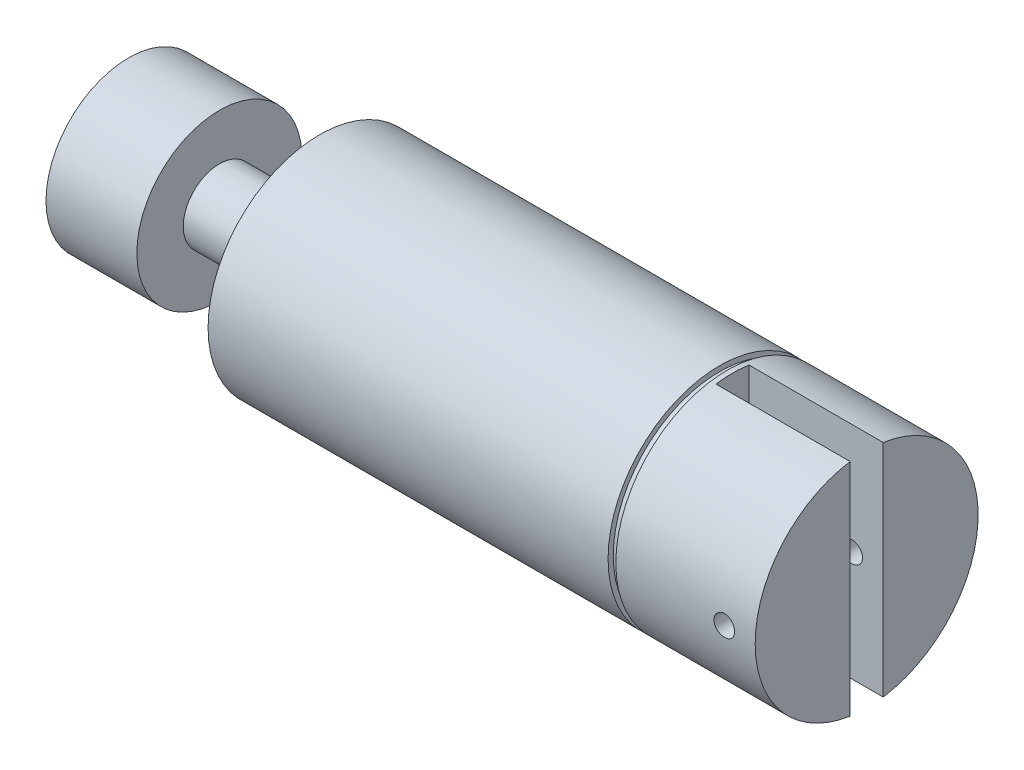
ISO-10303-21;
HEADER;
FILE_DESCRIPTION(('STEP AP214'),'2;1');
FILE_NAME('part.step','',(''),(''),'','','');
FILE_SCHEMA(('AUTOMOTIVE_DESIGN { 1 0 10303 214 1 1 1 1 }'));
ENDSEC;
DATA;
#1=APPLICATION_CONTEXT('core data for automotive mechanical design processes');
#2=APPLICATION_PROTOCOL_DEFINITION('international standard','automotive_design',2000,#1);
#3=PRODUCT_CONTEXT('',#1,'mechanical');
#4=PRODUCT('Part','Part','',(#3));
#5=PRODUCT_RELATED_PRODUCT_CATEGORY('part','',(#4));
#6=PRODUCT_DEFINITION_FORMATION('','',#4);
#7=PRODUCT_DEFINITION_CONTEXT('part definition',#1,'design');
#8=PRODUCT_DEFINITION('design','',#6,#7);
#9=PRODUCT_DEFINITION_SHAPE('','',#8);
#10=(LENGTH_UNIT() NAMED_UNIT(*) SI_UNIT(.MILLI.,.METRE.));
#11=(NAMED_UNIT(*) PLANE_ANGLE_UNIT() SI_UNIT($,.RADIAN.));
#12=(NAMED_UNIT(*) SI_UNIT($,.STERADIAN.) SOLID_ANGLE_UNIT());
#13=UNCERTAINTY_MEASURE_WITH_UNIT(LENGTH_MEASURE(1.E-05),#10,'distance_accuracy_value','');
#14=(GEOMETRIC_REPRESENTATION_CONTEXT(3) GLOBAL_UNCERTAINTY_ASSIGNED_CONTEXT((#13)) GLOBAL_UNIT_ASSIGNED_CONTEXT((#10,
#11,#12)) REPRESENTATION_CONTEXT('',''));
#15=CARTESIAN_POINT('',(0.,0.,0.));
#16=DIRECTION('',(0.,0.,1.));
#17=DIRECTION('',(1.,0.,0.));
#18=AXIS2_PLACEMENT_3D('',#15,#16,#17);
#19=CARTESIAN_POINT('',(14.25,10.8,0.));
#20=DIRECTION('',(-1.,0.,0.));
#21=DIRECTION('',(0.,0.,1.));
#22=AXIS2_PLACEMENT_3D('',#19,#20,#21);
#23=PLANE('',#22);
#24=CARTESIAN_POINT('',(14.25,0.,0.));
#25=DIRECTION('',(-1.,0.,0.));
#26=DIRECTION('',(0.,0.,1.));
#27=AXIS2_PLACEMENT_3D('',#24,#25,#26);
#28=CIRCLE('',#27,10.8);
#29=CARTESIAN_POINT('',(14.25,10.6808239382549,-1.6));
#30=VERTEX_POINT('',#29);
#31=CARTESIAN_POINT('',(14.25,-10.6808239382549,-1.6));
#32=VERTEX_POINT('',#31);
#33=EDGE_CURVE('E94',#30,#32,#28,.T.);
#34=ORIENTED_EDGE('',*,*,#33,.F.);
#35=DIRECTION('',(0.,-1.,0.));
#36=VECTOR('',#35,1.);
#37=CARTESIAN_POINT('',(14.25,10.8,-1.6));
#38=LINE('',#37,#36);
#39=EDGE_CURVE('E99',#30,#32,#38,.T.);
#40=ORIENTED_EDGE('',*,*,#39,.T.);
#41=EDGE_LOOP('',(#34,#40));
#42=FACE_BOUND('',#41,.T.);
#43=ADVANCED_FACE('F34',(#42),#23,.F.);
#44=CARTESIAN_POINT('',(11.25,0.,-10.8));
#45=DIRECTION('',(0.,0.,1.));
#46=DIRECTION('',(1.,0.,0.));
#47=AXIS2_PLACEMENT_3D('',#44,#45,#46);
#48=CYLINDRICAL_SURFACE('',#47,1.);
#49=CARTESIAN_POINT('',(11.25,0.,-1.6));
#50=DIRECTION('',(0.,0.,-1.));
#51=DIRECTION('',(-1.,0.,0.));
#52=AXIS2_PLACEMENT_3D('',#49,#50,#51);
#53=CIRCLE('',#52,1.);
#54=CARTESIAN_POINT('',(10.25,0.,-1.6));
#55=VERTEX_POINT('',#54);
#56=EDGE_CURVE('E168',#55,#55,#53,.F.);
#57=ORIENTED_EDGE('',*,*,#56,.T.);
#58=EDGE_LOOP('',(#57));
#59=FACE_BOUND('',#58,.T.);
#60=CARTESIAN_POINT('',(12.25,0.,-10.8));
#61=CARTESIAN_POINT('',(12.2499975630522,0.056041694169286,-10.7999993984621));
#62=CARTESIAN_POINT('',(12.2452731384611,0.112120953605781,-10.7995591535189));
#63=CARTESIAN_POINT('',(12.2264969786391,0.222726200407297,-10.7978452600452));
#64=CARTESIAN_POINT('',(12.2124348313937,0.27725038292349,-10.7965706812143));
#65=CARTESIAN_POINT('',(12.1753948260025,0.383127680910939,-10.7933320701452));
#66=CARTESIAN_POINT('',(12.152422194191,0.434482634825349,-10.7913684421245));
#67=CARTESIAN_POINT('',(12.0982231099392,0.532595965397221,-10.7869716001408));
#68=CARTESIAN_POINT('',(12.0669983566553,0.579355285604431,-10.7845384828761));
#69=CARTESIAN_POINT('',(11.9970769328136,0.667107113254774,-10.7794669781118));
#70=CARTESIAN_POINT('',(11.9583598686665,0.708083340709263,-10.7768280423656));
#71=CARTESIAN_POINT('',(11.8745961974482,0.782965996442765,-10.7716468892378));
#72=CARTESIAN_POINT('',(11.8295493047567,0.816872105525809,-10.7691046762272));
#73=CARTESIAN_POINT('',(11.7343042007546,0.87670863617081,-10.7643990862072));
#74=CARTESIAN_POINT('',(11.6840968103633,0.902624506157882,-10.7622364034351));
#75=CARTESIAN_POINT('',(11.5800197097756,0.945651973067532,-10.7585413255442));
#76=CARTESIAN_POINT('',(11.5261500780049,0.962763758459765,-10.7570089169331));
#77=CARTESIAN_POINT('',(11.4164424904994,0.987649491281799,-10.7547527065831));
#78=CARTESIAN_POINT('',(11.3606106634673,0.99545024291766,-10.7540265841647));
#79=CARTESIAN_POINT('',(11.2484258118544,1.00157530700786,-10.7534579028436));
#80=CARTESIAN_POINT('',(11.1920727991708,0.999899835245277,-10.7536153238217));
#81=CARTESIAN_POINT('',(11.0806294949238,0.987142132715217,-10.7547938275885));
#82=CARTESIAN_POINT('',(11.0255358279813,0.976089104743565,-10.7558122291493));
#83=CARTESIAN_POINT('',(10.9179889658701,0.944935451305753,-10.7585937505583));
#84=CARTESIAN_POINT('',(10.8655358017833,0.924834719364792,-10.7603568791706));
#85=CARTESIAN_POINT('',(10.764666267148,0.876123793953636,-10.7644322818291));
#86=CARTESIAN_POINT('',(10.7162562214265,0.847500576247833,-10.7667453952755));
#87=CARTESIAN_POINT('',(10.6249162969427,0.782566559739389,-10.7716594002237));
#88=CARTESIAN_POINT('',(10.5819865555822,0.746255568250036,-10.7742602989378));
#89=CARTESIAN_POINT('',(10.5026561133523,0.666813315203981,-10.779468759501));
#90=CARTESIAN_POINT('',(10.4662806748394,0.62365682128374,-10.7820763094324));
#91=CARTESIAN_POINT('',(10.4012869820992,0.531836426349958,-10.7869949583832));
#92=CARTESIAN_POINT('',(10.3726687347996,0.48317252041801,-10.7893060571377));
#93=CARTESIAN_POINT('',(10.3240030657427,0.38170169302142,-10.793372011029));
#94=CARTESIAN_POINT('',(10.3039568497009,0.328894189966698,-10.7951267879063));
#95=CARTESIAN_POINT('',(10.2730224094454,0.220643097444937,-10.797881542807));
#96=CARTESIAN_POINT('',(10.2621339505214,0.165199575576682,-10.7988815401752));
#97=CARTESIAN_POINT('',(10.2498559810726,0.0534691478416728,-10.8000115804614));
#98=CARTESIAN_POINT('',(10.2484315946852,-0.00281389460360721,-10.8001448174226));
#99=CARTESIAN_POINT('',(10.2550307139029,-0.11481793260741,-10.7995348735644));
#100=CARTESIAN_POINT('',(10.2630541103562,-0.170538934651779,-10.7987917028702));
#101=CARTESIAN_POINT('',(10.2882921194851,-0.279737084456633,-10.7965145350457));
#102=CARTESIAN_POINT('',(10.3054904790623,-0.33321802028151,-10.7949819365219));
#103=CARTESIAN_POINT('',(10.348573561244,-0.436535467996115,-10.7912979552997));
#104=CARTESIAN_POINT('',(10.3744584520555,-0.486371909290647,-10.789146560619));
#105=CARTESIAN_POINT('',(10.4342668489675,-0.581143860501928,-10.7844579161258));
#106=CARTESIAN_POINT('',(10.4682133580762,-0.626064798641822,-10.7819195697475));
#107=CARTESIAN_POINT('',(10.5431482777635,-0.709583291521042,-10.7767456064924));
#108=CARTESIAN_POINT('',(10.5841368395588,-0.748180710438241,-10.7741099875279));
#109=CARTESIAN_POINT('',(10.67214413736,-0.818076937797071,-10.7690289901941));
#110=CARTESIAN_POINT('',(10.719181044193,-0.849352917684015,-10.766584222294));
#111=CARTESIAN_POINT('',(10.8178598208437,-0.90356171354973,-10.7621707416873));
#112=CARTESIAN_POINT('',(10.8695016355269,-0.926494629403297,-10.760202023282));
#113=CARTESIAN_POINT('',(10.9758448312878,-0.963327785298282,-10.7569671965354));
#114=CARTESIAN_POINT('',(11.0305414106496,-0.977241790789694,-10.755700017876));
#115=CARTESIAN_POINT('',(11.1415067657083,-0.995686895548999,-10.7540083112559));
#116=CARTESIAN_POINT('',(11.1977755032658,-1.00021822223355,-10.7535837628715));
#117=CARTESIAN_POINT('',(11.3100610328297,-0.999766435959497,-10.7536257578542));
#118=CARTESIAN_POINT('',(11.3660779738617,-0.994819186625931,-10.7540889423519));
#119=CARTESIAN_POINT('',(11.4764815162601,-0.975625685916233,-10.7558470642704));
#120=CARTESIAN_POINT('',(11.5308681154654,-0.961379422214151,-10.7571420027937));
#121=CARTESIAN_POINT('',(11.6364680612114,-0.924001819684752,-10.7604168172301));
#122=CARTESIAN_POINT('',(11.6876817171886,-0.900871348865349,-10.7623966262279));
#123=CARTESIAN_POINT('',(11.7855051409719,-0.846385741291245,-10.7668182379027));
#124=CARTESIAN_POINT('',(11.8321149561552,-0.815030689186388,-10.7692600358248));
#125=CARTESIAN_POINT('',(11.9195913621343,-0.744851144386887,-10.7743415353223));
#126=CARTESIAN_POINT('',(11.9604365184867,-0.705999983692884,-10.7769819222939));
#127=CARTESIAN_POINT('',(12.0350444431454,-0.621982204953402,-10.7821568198931));
#128=CARTESIAN_POINT('',(12.0688055048018,-0.576814069424837,-10.78469130489));
#129=CARTESIAN_POINT('',(12.1283435012146,-0.481337749632206,-10.7893744855846));
#130=CARTESIAN_POINT('',(12.1541026431354,-0.431018436778846,-10.791522317138));
#131=CARTESIAN_POINT('',(12.1967723984703,-0.326782059531711,-10.7951804981151));
#132=CARTESIAN_POINT('',(12.2136930795958,-0.272869167826085,-10.7966915724751));
#133=CARTESIAN_POINT('',(12.2339442022142,-0.182204148576473,-10.7985224450956));
#134=CARTESIAN_POINT('',(12.2399570048322,-0.146033286416626,-10.7990739731517));
#135=CARTESIAN_POINT('',(12.2479856933553,-0.073246965140854,-10.7998129465793));
#136=CARTESIAN_POINT('',(12.2500015929046,-0.0366315075430489,-10.8000003931937));
#137=CARTESIAN_POINT('',(12.25,0.,-10.8));
#138=B_SPLINE_CURVE_WITH_KNOTS('',3,(#60,#61,#62,#63,#64,#65,#66,#67,#68,#69,#70,#71,#72,#73,
#74,#75,#76,#77,#78,#79,#80,#81,#82,#83,#84,#85,#86,#87,#88,#89,#90,#91,#92,#93,#94,#95,#96,#97,
#98,#99,#100,#101,#102,#103,#104,#105,#106,#107,#108,#109,#110,#111,#112,#113,#114,#115,#116,
#117,#118,#119,#120,#121,#122,#123,#124,#125,#126,#127,#128,#129,#130,#131,#132,#133,#134,#135,
#136,#137),.UNSPECIFIED.,.T.,.F.,(4,2,2,2,2,2,2,2,2,2,2,2,2,2,2,2,2,2,2,2,2,2,2,2,2,2,2,2,2,2,2,
2,2,2,2,2,2,2,4),(0.,0.167991327143444,0.336170288034028,0.50425075444162,0.672296639101812,
0.840806536567126,1.00932404013418,1.17814665403541,1.34696565378875,1.51529748339252,
1.6836254799279,1.85143119955235,2.0192388939925,2.18730436342397,2.35537404575479,
2.524078275821,2.6927826565501,2.86151075891693,3.03023453670582,3.19833620740399,
3.36643593601411,3.53423886636672,3.70204504626318,3.87033592233155,4.03863041262609,
4.20744286326006,4.37625329297416,4.5448054589354,4.71335353949422,4.88126515210961,
5.04917698729422,5.21707242126928,5.38496612728226,5.55346852453451,5.72201146970069,
5.89092654296184,6.05964878658267,6.16945625521025,6.27926334899355),.UNSPECIFIED.);
#139=CARTESIAN_POINT('',(12.25,0.,-10.8));
#140=VERTEX_POINT('',#139);
#141=EDGE_CURVE('E138',#140,#140,#138,.T.);
#142=ORIENTED_EDGE('',*,*,#141,.F.);
#143=EDGE_LOOP('',(#142));
#144=FACE_BOUND('',#143,.T.);
#145=ADVANCED_FACE('F152',(#59,#144),#48,.F.);
#146=CARTESIAN_POINT('',(-57.25,0.,0.));
#147=DIRECTION('',(1.,0.,0.));
#148=DIRECTION('',(0.,0.,-1.));
#149=AXIS2_PLACEMENT_3D('',#146,#147,#148);
#150=PLANE('',#149);
#151=CARTESIAN_POINT('',(-57.25,0.,0.));
#152=DIRECTION('',(-1.,0.,0.));
#153=DIRECTION('',(0.,0.,1.));
#154=AXIS2_PLACEMENT_3D('',#151,#152,#153);
#155=CIRCLE('',#154,8.);
#156=CARTESIAN_POINT('',(-57.25,0.,8.));
#157=VERTEX_POINT('',#156);
#158=EDGE_CURVE('E127',#157,#157,#155,.T.);
#159=ORIENTED_EDGE('',*,*,#158,.T.);
#160=EDGE_LOOP('',(#159));
#161=FACE_BOUND('',#160,.T.);
#162=ADVANCED_FACE('F36',(#161),#150,.F.);
#163=CARTESIAN_POINT('',(-38.3901193409337,0.,0.));
#164=DIRECTION('',(-1.,0.,0.));
#165=DIRECTION('',(0.,0.,1.));
#166=AXIS2_PLACEMENT_3D('',#163,#164,#165);
#167=CYLINDRICAL_SURFACE('',#166,7.99999999999999);
#168=ORIENTED_EDGE('',*,*,#158,.F.);
#169=EDGE_LOOP('',(#168));
#170=FACE_BOUND('',#169,.T.);
#171=CARTESIAN_POINT('',(-48.45,0.,0.));
#172=DIRECTION('',(-1.,0.,0.));
#173=DIRECTION('',(0.,0.,1.));
#174=AXIS2_PLACEMENT_3D('',#171,#172,#173);
#175=CIRCLE('',#174,7.99999999999999);
#176=CARTESIAN_POINT('',(-48.45,0.,7.99999999999999));
#177=VERTEX_POINT('',#176);
#178=EDGE_CURVE('E124',#177,#177,#175,.T.);
#179=ORIENTED_EDGE('',*,*,#178,.T.);
#180=EDGE_LOOP('',(#179));
#181=FACE_BOUND('',#180,.T.);
#182=ADVANCED_FACE('F225',(#170,#181),#167,.T.);
#183=CARTESIAN_POINT('',(-48.4500000000001,3.50447016523652,0.));
#184=DIRECTION('',(-1.,0.,0.));
#185=DIRECTION('',(0.,0.,1.));
#186=AXIS2_PLACEMENT_3D('',#183,#184,#185);
#187=PLANE('',#186);
#188=ORIENTED_EDGE('',*,*,#178,.F.);
#189=EDGE_LOOP('',(#188));
#190=FACE_BOUND('',#189,.T.);
#191=CARTESIAN_POINT('',(-48.4500000000001,0.,0.));
#192=DIRECTION('',(-1.,0.,0.));
#193=DIRECTION('',(0.,0.,1.));
#194=AXIS2_PLACEMENT_3D('',#191,#192,#193);
#195=CIRCLE('',#194,3.50447016523652);
#196=CARTESIAN_POINT('',(-48.4500000000001,0.,3.50447016523652));
#197=VERTEX_POINT('',#196);
#198=EDGE_CURVE('E121',#197,#197,#195,.T.);
#199=ORIENTED_EDGE('',*,*,#198,.T.);
#200=EDGE_LOOP('',(#199));
#201=FACE_BOUND('',#200,.T.);
#202=ADVANCED_FACE('F222',(#190,#201),#187,.F.);
#203=CARTESIAN_POINT('',(-38.3901193409337,0.,0.));
#204=DIRECTION('',(-1.,0.,0.));
#205=DIRECTION('',(0.,0.,1.));
#206=AXIS2_PLACEMENT_3D('',#203,#204,#205);
#207=CYLINDRICAL_SURFACE('',#206,3.50447016523652);
#208=ORIENTED_EDGE('',*,*,#198,.F.);
#209=EDGE_LOOP('',(#208));
#210=FACE_BOUND('',#209,.T.);
#211=CARTESIAN_POINT('',(-38.75,0.,0.));
#212=DIRECTION('',(-1.,0.,0.));
#213=DIRECTION('',(0.,0.,1.));
#214=AXIS2_PLACEMENT_3D('',#211,#212,#213);
#215=CIRCLE('',#214,3.50447016523652);
#216=CARTESIAN_POINT('',(-38.75,0.,3.50447016523652));
#217=VERTEX_POINT('',#216);
#218=EDGE_CURVE('E118',#217,#217,#215,.T.);
#219=ORIENTED_EDGE('',*,*,#218,.T.);
#220=EDGE_LOOP('',(#219));
#221=FACE_BOUND('',#220,.T.);
#222=ADVANCED_FACE('F218',(#210,#221),#207,.T.);
#223=CARTESIAN_POINT('',(-38.75,3.50447016523652,0.));
#224=DIRECTION('',(1.,0.,0.));
#225=DIRECTION('',(0.,0.,-1.));
#226=AXIS2_PLACEMENT_3D('',#223,#224,#225);
#227=PLANE('',#226);
#228=ORIENTED_EDGE('',*,*,#218,.F.);
#229=EDGE_LOOP('',(#228));
#230=FACE_BOUND('',#229,.T.);
#231=CARTESIAN_POINT('',(-38.75,0.,0.));
#232=DIRECTION('',(-1.,0.,0.));
#233=DIRECTION('',(0.,0.,1.));
#234=AXIS2_PLACEMENT_3D('',#231,#232,#233);
#235=CIRCLE('',#234,10.8);
#236=CARTESIAN_POINT('',(-38.75,0.,10.8));
#237=VERTEX_POINT('',#236);
#238=EDGE_CURVE('E115',#237,#237,#235,.T.);
#239=ORIENTED_EDGE('',*,*,#238,.T.);
#240=EDGE_LOOP('',(#239));
#241=FACE_BOUND('',#240,.T.);
#242=ADVANCED_FACE('F214',(#230,#241),#227,.F.);
#243=CARTESIAN_POINT('',(-38.3901193409337,0.,0.));
#244=DIRECTION('',(-1.,0.,0.));
#245=DIRECTION('',(0.,0.,1.));
#246=AXIS2_PLACEMENT_3D('',#243,#244,#245);
#247=CYLINDRICAL_SURFACE('',#246,10.8);
#248=ORIENTED_EDGE('',*,*,#238,.F.);
#249=EDGE_LOOP('',(#248));
#250=FACE_BOUND('',#249,.T.);
#251=CARTESIAN_POINT('',(0.,0.,0.));
#252=DIRECTION('',(-1.,0.,0.));
#253=DIRECTION('',(0.,0.,1.));
#254=AXIS2_PLACEMENT_3D('',#251,#252,#253);
#255=CIRCLE('',#254,10.8);
#256=CARTESIAN_POINT('',(0.,0.,10.8));
#257=VERTEX_POINT('',#256);
#258=EDGE_CURVE('E112',#257,#257,#255,.T.);
#259=ORIENTED_EDGE('',*,*,#258,.T.);
#260=EDGE_LOOP('',(#259));
#261=FACE_BOUND('',#260,.T.);
#262=ADVANCED_FACE('F210',(#250,#261),#247,.T.);
#263=CARTESIAN_POINT('',(0.,10.3,0.));
#264=DIRECTION('',(-1.,0.,0.));
#265=DIRECTION('',(0.,0.,1.));
#266=AXIS2_PLACEMENT_3D('',#263,#264,#265);
#267=PLANE('',#266);
#268=ORIENTED_EDGE('',*,*,#258,.F.);
#269=EDGE_LOOP('',(#268));
#270=FACE_BOUND('',#269,.T.);
#271=CARTESIAN_POINT('',(0.,0.,0.));
#272=DIRECTION('',(-1.,0.,0.));
#273=DIRECTION('',(0.,0.,1.));
#274=AXIS2_PLACEMENT_3D('',#271,#272,#273);
#275=CIRCLE('',#274,10.3);
#276=CARTESIAN_POINT('',(0.,0.,10.3));
#277=VERTEX_POINT('',#276);
#278=EDGE_CURVE('E109',#277,#277,#275,.T.);
#279=ORIENTED_EDGE('',*,*,#278,.T.);
#280=EDGE_LOOP('',(#279));
#281=FACE_BOUND('',#280,.T.);
#282=ADVANCED_FACE('F203',(#270,#281),#267,.F.);
#283=CARTESIAN_POINT('',(-38.3901193409337,0.,0.));
#284=DIRECTION('',(-1.,0.,0.));
#285=DIRECTION('',(0.,0.,1.));
#286=AXIS2_PLACEMENT_3D('',#283,#284,#285);
#287=CYLINDRICAL_SURFACE('',#286,10.3);
#288=ORIENTED_EDGE('',*,*,#278,.F.);
#289=EDGE_LOOP('',(#288));
#290=FACE_BOUND('',#289,.T.);
#291=CARTESIAN_POINT('',(0.750000000000001,0.,0.));
#292=DIRECTION('',(-1.,0.,0.));
#293=DIRECTION('',(0.,0.,1.));
#294=AXIS2_PLACEMENT_3D('',#291,#292,#293);
#295=CIRCLE('',#294,10.3);
#296=CARTESIAN_POINT('',(0.750000000000001,0.,10.3));
#297=VERTEX_POINT('',#296);
#298=EDGE_CURVE('E106',#297,#297,#295,.T.);
#299=ORIENTED_EDGE('',*,*,#298,.T.);
#300=EDGE_LOOP('',(#299));
#301=FACE_BOUND('',#300,.T.);
#302=ADVANCED_FACE('F198',(#290,#301),#287,.T.);
#303=CARTESIAN_POINT('',(0.75,10.8,0.));
#304=DIRECTION('',(1.,0.,0.));
#305=DIRECTION('',(0.,0.,-1.));
#306=AXIS2_PLACEMENT_3D('',#303,#304,#305);
#307=PLANE('',#306);
#308=ORIENTED_EDGE('',*,*,#298,.F.);
#309=EDGE_LOOP('',(#308));
#310=FACE_BOUND('',#309,.T.);
#311=CARTESIAN_POINT('',(0.750000000000001,0.,0.));
#312=DIRECTION('',(-1.,0.,0.));
#313=DIRECTION('',(0.,0.,1.));
#314=AXIS2_PLACEMENT_3D('',#311,#312,#313);
#315=CIRCLE('',#314,10.8);
#316=CARTESIAN_POINT('',(0.750000000000001,0.,10.8));
#317=VERTEX_POINT('',#316);
#318=EDGE_CURVE('E103',#317,#317,#315,.T.);
#319=ORIENTED_EDGE('',*,*,#318,.T.);
#320=EDGE_LOOP('',(#319));
#321=FACE_BOUND('',#320,.T.);
#322=ADVANCED_FACE('F160',(#310,#321),#307,.F.);
#323=CARTESIAN_POINT('',(-38.3901193409337,0.,0.));
#324=DIRECTION('',(-1.,0.,0.));
#325=DIRECTION('',(0.,0.,1.));
#326=AXIS2_PLACEMENT_3D('',#323,#324,#325);
#327=CYLINDRICAL_SURFACE('',#326,10.8);
#328=ORIENTED_EDGE('',*,*,#141,.T.);
#329=EDGE_LOOP('',(#328));
#330=FACE_BOUND('',#329,.T.);
#331=CARTESIAN_POINT('',(12.25,0.,10.8));
#332=CARTESIAN_POINT('',(12.2499975630522,-0.0560416941692861,10.7999993984621));
#333=CARTESIAN_POINT('',(12.2452731384611,-0.112120953605781,10.7995591535189));
#334=CARTESIAN_POINT('',(12.2264969786391,-0.222726200407297,10.7978452600452));
#335=CARTESIAN_POINT('',(12.2124348313937,-0.27725038292349,10.7965706812143));
#336=CARTESIAN_POINT('',(12.1753948260025,-0.383127680910939,10.7933320701452));
#337=CARTESIAN_POINT('',(12.152422194191,-0.434482634825349,10.7913684421245));
#338=CARTESIAN_POINT('',(12.0982231099392,-0.532595965397222,10.7869716001408));
#339=CARTESIAN_POINT('',(12.0669983566553,-0.579355285604431,10.7845384828761));
#340=CARTESIAN_POINT('',(11.9970769328136,-0.667107113254775,10.7794669781118));
#341=CARTESIAN_POINT('',(11.9583598686665,-0.708083340709264,10.7768280423656));
#342=CARTESIAN_POINT('',(11.8745961974482,-0.782965996442766,10.7716468892378));
#343=CARTESIAN_POINT('',(11.8295493047567,-0.81687210552581,10.7691046762272));
#344=CARTESIAN_POINT('',(11.7343042007546,-0.87670863617081,10.7643990862072));
#345=CARTESIAN_POINT('',(11.6840968103633,-0.902624506157882,10.7622364034351));
#346=CARTESIAN_POINT('',(11.5800197097756,-0.945651973067532,10.7585413255442));
#347=CARTESIAN_POINT('',(11.5261500780049,-0.962763758459765,10.7570089169331));
#348=CARTESIAN_POINT('',(11.4164424904994,-0.987649491281799,10.7547527065831));
#349=CARTESIAN_POINT('',(11.3606106634673,-0.99545024291766,10.7540265841647));
#350=CARTESIAN_POINT('',(11.2484258118544,-1.00157530700786,10.7534579028436));
#351=CARTESIAN_POINT('',(11.1920727991708,-0.999899835245277,10.7536153238217));
#352=CARTESIAN_POINT('',(11.0806294949238,-0.987142132715217,10.7547938275885));
#353=CARTESIAN_POINT('',(11.0255358279813,-0.976089104743565,10.7558122291493));
#354=CARTESIAN_POINT('',(10.9179889658701,-0.944935451305753,10.7585937505583));
#355=CARTESIAN_POINT('',(10.8655358017833,-0.924834719364792,10.7603568791706));
#356=CARTESIAN_POINT('',(10.764666267148,-0.876123793953636,10.7644322818291));
#357=CARTESIAN_POINT('',(10.7162562214265,-0.847500576247833,10.7667453952755));
#358=CARTESIAN_POINT('',(10.6249162969427,-0.782566559739389,10.7716594002237));
#359=CARTESIAN_POINT('',(10.5819865555822,-0.746255568250036,10.7742602989378));
#360=CARTESIAN_POINT('',(10.5026561133523,-0.666813315203982,10.779468759501));
#361=CARTESIAN_POINT('',(10.4662806748394,-0.623656821283741,10.7820763094324));
#362=CARTESIAN_POINT('',(10.4012869820992,-0.531836426349958,10.7869949583832));
#363=CARTESIAN_POINT('',(10.3726687347996,-0.48317252041801,10.7893060571377));
#364=CARTESIAN_POINT('',(10.3240030657427,-0.38170169302142,10.793372011029));
#365=CARTESIAN_POINT('',(10.3039568497009,-0.328894189966697,10.7951267879063));
#366=CARTESIAN_POINT('',(10.2730224094454,-0.220643097444937,10.797881542807));
#367=CARTESIAN_POINT('',(10.2621339505214,-0.165199575576681,10.7988815401752));
#368=CARTESIAN_POINT('',(10.2498559810726,-0.0534691478416725,10.8000115804614));
#369=CARTESIAN_POINT('',(10.2484315946852,0.00281389460360758,10.8001448174226));
#370=CARTESIAN_POINT('',(10.2550307139029,0.11481793260741,10.7995348735644));
#371=CARTESIAN_POINT('',(10.2630541103562,0.170538934651779,10.7987917028702));
#372=CARTESIAN_POINT('',(10.2882921194851,0.279737084456634,10.7965145350457));
#373=CARTESIAN_POINT('',(10.3054904790623,0.333218020281512,10.7949819365219));
#374=CARTESIAN_POINT('',(10.348573561244,0.436535467996117,10.7912979552997));
#375=CARTESIAN_POINT('',(10.3744584520555,0.486371909290648,10.789146560619));
#376=CARTESIAN_POINT('',(10.4342668489675,0.581143860501929,10.7844579161258));
#377=CARTESIAN_POINT('',(10.4682133580762,0.626064798641824,10.7819195697475));
#378=CARTESIAN_POINT('',(10.5431482777635,0.709583291521043,10.7767456064924));
#379=CARTESIAN_POINT('',(10.5841368395588,0.748180710438242,10.7741099875279));
#380=CARTESIAN_POINT('',(10.67214413736,0.818076937797071,10.7690289901941));
#381=CARTESIAN_POINT('',(10.719181044193,0.849352917684016,10.766584222294));
#382=CARTESIAN_POINT('',(10.8178598208437,0.903561713549731,10.7621707416873));
#383=CARTESIAN_POINT('',(10.8695016355269,0.926494629403298,10.760202023282));
#384=CARTESIAN_POINT('',(10.9758448312878,0.963327785298283,10.7569671965354));
#385=CARTESIAN_POINT('',(11.0305414106496,0.977241790789694,10.755700017876));
#386=CARTESIAN_POINT('',(11.1415067657083,0.995686895548999,10.7540083112559));
#387=CARTESIAN_POINT('',(11.1977755032658,1.00021822223355,10.7535837628715));
#388=CARTESIAN_POINT('',(11.3100610328297,0.999766435959497,10.7536257578542));
#389=CARTESIAN_POINT('',(11.3660779738617,0.994819186625931,10.7540889423519));
#390=CARTESIAN_POINT('',(11.4764815162601,0.975625685916233,10.7558470642704));
#391=CARTESIAN_POINT('',(11.5308681154654,0.961379422214151,10.7571420027937));
#392=CARTESIAN_POINT('',(11.6364680612114,0.924001819684752,10.7604168172301));
#393=CARTESIAN_POINT('',(11.6876817171886,0.900871348865349,10.7623966262279));
#394=CARTESIAN_POINT('',(11.7855051409719,0.846385741291245,10.7668182379027));
#395=CARTESIAN_POINT('',(11.8321149561552,0.815030689186388,10.7692600358248));
#396=CARTESIAN_POINT('',(11.9195913621343,0.744851144386887,10.7743415353223));
#397=CARTESIAN_POINT('',(11.9604365184867,0.705999983692884,10.7769819222939));
#398=CARTESIAN_POINT('',(12.0350444431454,0.621982204953401,10.7821568198931));
#399=CARTESIAN_POINT('',(12.0688055048018,0.576814069424836,10.78469130489));
#400=CARTESIAN_POINT('',(12.1283435012146,0.481337749632206,10.7893744855846));
#401=CARTESIAN_POINT('',(12.1541026431354,0.431018436778846,10.791522317138));
#402=CARTESIAN_POINT('',(12.1967723984703,0.326782059531711,10.7951804981151));
#403=CARTESIAN_POINT('',(12.2136930795958,0.272869167826085,10.7966915724751));
#404=CARTESIAN_POINT('',(12.2339442022142,0.182204148576473,10.7985224450956));
#405=CARTESIAN_POINT('',(12.2399570048322,0.146033286416626,10.7990739731517));
#406=CARTESIAN_POINT('',(12.2479856933553,0.073246965140854,10.7998129465793));
#407=CARTESIAN_POINT('',(12.2500015929046,0.0366315075430489,10.8000003931937));
#408=CARTESIAN_POINT('',(12.25,0.,10.8));
#409=B_SPLINE_CURVE_WITH_KNOTS('',3,(#331,#332,#333,#334,#335,#336,#337,#338,#339,#340,#341,
#342,#343,#344,#345,#346,#347,#348,#349,#350,#351,#352,#353,#354,#355,#356,#357,#358,#359,#360,
#361,#362,#363,#364,#365,#366,#367,#368,#369,#370,#371,#372,#373,#374,#375,#376,#377,#378,#379,
#380,#381,#382,#383,#384,#385,#386,#387,#388,#389,#390,#391,#392,#393,#394,#395,#396,#397,#398,
#399,#400,#401,#402,#403,#404,#405,#406,#407,#408),.UNSPECIFIED.,.T.,.F.,(4,2,2,2,2,2,2,2,2,2,2,
2,2,2,2,2,2,2,2,2,2,2,2,2,2,2,2,2,2,2,2,2,2,2,2,2,2,2,4),(0.,0.167991327143444,
0.336170288034029,0.50425075444162,0.672296639101813,0.840806536567128,1.00932404013419,
1.17814665403541,1.34696565378875,1.51529748339252,1.6836254799279,1.85143119955235,
2.0192388939925,2.18730436342397,2.35537404575479,2.524078275821,2.6927826565501,
2.86151075891693,3.03023453670582,3.19833620740399,3.36643593601411,3.53423886636673,
3.70204504626319,3.87033592233155,4.03863041262609,4.20744286326007,4.37625329297417,
4.5448054589354,4.71335353949422,4.88126515210961,5.04917698729422,5.21707242126929,
5.38496612728226,5.55346852453451,5.72201146970069,5.89092654296184,6.05964878658267,
6.16945625521025,6.27926334899355),.UNSPECIFIED.);
#410=CARTESIAN_POINT('',(12.25,0.,10.8));
#411=VERTEX_POINT('',#410);
#412=EDGE_CURVE('E130',#411,#411,#409,.T.);
#413=ORIENTED_EDGE('',*,*,#412,.T.);
#414=EDGE_LOOP('',(#413));
#415=FACE_BOUND('',#414,.T.);
#416=ORIENTED_EDGE('',*,*,#318,.F.);
#417=EDGE_LOOP('',(#416));
#418=FACE_BOUND('',#417,.T.);
#419=DIRECTION('',(-1.,0.,0.));
#420=VECTOR('',#419,1.);
#421=CARTESIAN_POINT('',(-38.3901193409337,-10.6808239382549,-1.6));
#422=LINE('',#421,#420);
#423=CARTESIAN_POINT('',(1.25,-10.6808239382549,-1.6));
#424=VERTEX_POINT('',#423);
#425=EDGE_CURVE('E57',#32,#424,#422,.T.);
#426=ORIENTED_EDGE('',*,*,#425,.T.);
#427=CARTESIAN_POINT('',(1.25,0.,0.));
#428=DIRECTION('',(-1.,0.,0.));
#429=DIRECTION('',(0.,0.,1.));
#430=AXIS2_PLACEMENT_3D('',#427,#428,#429);
#431=CIRCLE('',#430,10.8);
#432=CARTESIAN_POINT('',(1.25,-10.6808239382549,1.6));
#433=VERTEX_POINT('',#432);
#434=EDGE_CURVE('E11',#424,#433,#431,.T.);
#435=ORIENTED_EDGE('',*,*,#434,.T.);
#436=DIRECTION('',(-1.,0.,0.));
#437=VECTOR('',#436,1.);
#438=CARTESIAN_POINT('',(-38.3901193409337,-10.6808239382549,1.6));
#439=LINE('',#438,#437);
#440=CARTESIAN_POINT('',(14.25,-10.6808239382549,1.6));
#441=VERTEX_POINT('',#440);
#442=EDGE_CURVE('E75',#433,#441,#439,.F.);
#443=ORIENTED_EDGE('',*,*,#442,.T.);
#444=CARTESIAN_POINT('',(14.25,10.6808239382549,1.6));
#445=VERTEX_POINT('',#444);
#446=EDGE_CURVE('E95',#441,#445,#28,.T.);
#447=ORIENTED_EDGE('',*,*,#446,.T.);
#448=DIRECTION('',(-1.,0.,0.));
#449=VECTOR('',#448,1.);
#450=CARTESIAN_POINT('',(-38.3901193409337,10.6808239382549,1.6));
#451=LINE('',#450,#449);
#452=CARTESIAN_POINT('',(1.25,10.6808239382549,1.6));
#453=VERTEX_POINT('',#452);
#454=EDGE_CURVE('E49',#445,#453,#451,.T.);
#455=ORIENTED_EDGE('',*,*,#454,.T.);
#456=CARTESIAN_POINT('',(1.25,10.6808239382549,-1.6));
#457=VERTEX_POINT('',#456);
#458=EDGE_CURVE('E38',#453,#457,#431,.T.);
#459=ORIENTED_EDGE('',*,*,#458,.T.);
#460=DIRECTION('',(-1.,0.,0.));
#461=VECTOR('',#460,1.);
#462=CARTESIAN_POINT('',(-38.3901193409337,10.6808239382549,-1.6));
#463=LINE('',#462,#461);
#464=EDGE_CURVE('E96',#457,#30,#463,.F.);
#465=ORIENTED_EDGE('',*,*,#464,.T.);
#466=ORIENTED_EDGE('',*,*,#33,.T.);
#467=EDGE_LOOP('',(#426,#435,#443,#447,#455,#459,#465,#466));
#468=FACE_BOUND('',#467,.T.);
#469=ADVANCED_FACE('F90',(#330,#415,#418,#468),#327,.T.);
#470=ORIENTED_EDGE('',*,*,#446,.F.);
#471=DIRECTION('',(0.,1.,0.));
#472=VECTOR('',#471,1.);
#473=CARTESIAN_POINT('',(14.25,10.8,1.6));
#474=LINE('',#473,#472);
#475=EDGE_CURVE('E79',#441,#445,#474,.T.);
#476=ORIENTED_EDGE('',*,*,#475,.T.);
#477=EDGE_LOOP('',(#470,#476));
#478=FACE_BOUND('',#477,.T.);
#479=ADVANCED_FACE('F150',(#478),#23,.F.);
#480=CARTESIAN_POINT('',(11.25,0.,1.6));
#481=DIRECTION('',(0.,0.,1.));
#482=DIRECTION('',(1.,0.,0.));
#483=AXIS2_PLACEMENT_3D('',#480,#481,#482);
#484=CIRCLE('',#483,1.);
#485=CARTESIAN_POINT('',(12.25,0.,1.6));
#486=VERTEX_POINT('',#485);
#487=EDGE_CURVE('E172',#486,#486,#484,.F.);
#488=ORIENTED_EDGE('',*,*,#487,.T.);
#489=EDGE_LOOP('',(#488));
#490=FACE_BOUND('',#489,.T.);
#491=ORIENTED_EDGE('',*,*,#412,.F.);
#492=EDGE_LOOP('',(#491));
#493=FACE_BOUND('',#492,.T.);
#494=ADVANCED_FACE('F146',(#490,#493),#48,.F.);
#495=CARTESIAN_POINT('',(1.25,-10.8,-1.6));
#496=DIRECTION('',(-1.,0.,0.));
#497=DIRECTION('',(0.,0.,1.));
#498=AXIS2_PLACEMENT_3D('',#495,#496,#497);
#499=PLANE('',#498);
#500=DIRECTION('',(0.,1.,0.));
#501=VECTOR('',#500,1.);
#502=CARTESIAN_POINT('',(1.25,-10.8,1.6));
#503=LINE('',#502,#501);
#504=EDGE_CURVE('E78',#433,#453,#503,.T.);
#505=ORIENTED_EDGE('',*,*,#504,.F.);
#506=ORIENTED_EDGE('',*,*,#434,.F.);
#507=DIRECTION('',(0.,1.,0.));
#508=VECTOR('',#507,1.);
#509=CARTESIAN_POINT('',(1.25,-10.8,-1.6));
#510=LINE('',#509,#508);
#511=EDGE_CURVE('E88',#424,#457,#510,.T.);
#512=ORIENTED_EDGE('',*,*,#511,.T.);
#513=ORIENTED_EDGE('',*,*,#458,.F.);
#514=EDGE_LOOP('',(#505,#506,#512,#513));
#515=FACE_BOUND('',#514,.T.);
#516=ADVANCED_FACE('F85',(#515),#499,.F.);
#517=CARTESIAN_POINT('',(27.25,-10.8,-1.6));
#518=DIRECTION('',(0.,0.,-1.));
#519=DIRECTION('',(-1.,0.,0.));
#520=AXIS2_PLACEMENT_3D('',#517,#518,#519);
#521=PLANE('',#520);
#522=ORIENTED_EDGE('',*,*,#56,.F.);
#523=EDGE_LOOP('',(#522));
#524=FACE_BOUND('',#523,.T.);
#525=ORIENTED_EDGE('',*,*,#39,.F.);
#526=ORIENTED_EDGE('',*,*,#464,.F.);
#527=ORIENTED_EDGE('',*,*,#511,.F.);
#528=ORIENTED_EDGE('',*,*,#425,.F.);
#529=EDGE_LOOP('',(#525,#526,#527,#528));
#530=FACE_BOUND('',#529,.T.);
#531=ADVANCED_FACE('F179',(#524,#530),#521,.F.);
#532=CARTESIAN_POINT('',(27.25,-10.8,1.6));
#533=DIRECTION('',(0.,0.,1.));
#534=DIRECTION('',(1.,0.,0.));
#535=AXIS2_PLACEMENT_3D('',#532,#533,#534);
#536=PLANE('',#535);
#537=ORIENTED_EDGE('',*,*,#487,.F.);
#538=EDGE_LOOP('',(#537));
#539=FACE_BOUND('',#538,.T.);
#540=ORIENTED_EDGE('',*,*,#475,.F.);
#541=ORIENTED_EDGE('',*,*,#442,.F.);
#542=ORIENTED_EDGE('',*,*,#504,.T.);
#543=ORIENTED_EDGE('',*,*,#454,.F.);
#544=EDGE_LOOP('',(#540,#541,#542,#543));
#545=FACE_BOUND('',#544,.T.);
#546=ADVANCED_FACE('F77',(#539,#545),#536,.F.);
#547=CLOSED_SHELL('',(#43,#145,#162,#182,#202,#222,#242,#262,#282,#302,#322,#469,#479,#494,#516,
#531,#546));
#548=MANIFOLD_SOLID_BREP('B2',#547);
#549=ADVANCED_BREP_SHAPE_REPRESENTATION('',(#18,#548),#14);
#550=SHAPE_DEFINITION_REPRESENTATION(#9,#549);
ENDSEC;
END-ISO-10303-21;
